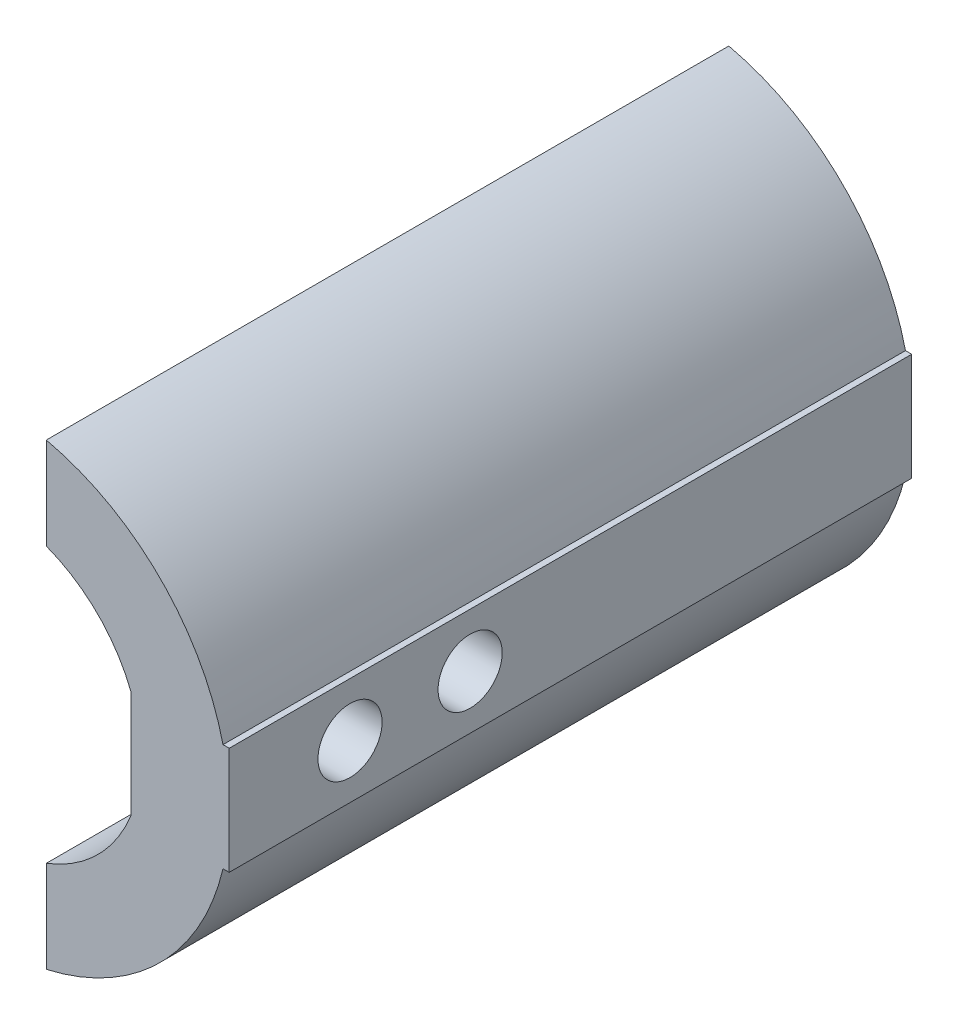
ISO-10303-21;
HEADER;
FILE_DESCRIPTION(('STEP AP214'),'2;1');
FILE_NAME('part.step','',(''),(''),'','','');
FILE_SCHEMA(('AUTOMOTIVE_DESIGN { 1 0 10303 214 1 1 1 1 }'));
ENDSEC;
DATA;
#1=APPLICATION_CONTEXT('core data for automotive mechanical design processes');
#2=APPLICATION_PROTOCOL_DEFINITION('international standard','automotive_design',2000,#1);
#3=PRODUCT_CONTEXT('',#1,'mechanical');
#4=PRODUCT('Part','Part','',(#3));
#5=PRODUCT_RELATED_PRODUCT_CATEGORY('part','',(#4));
#6=PRODUCT_DEFINITION_FORMATION('','',#4);
#7=PRODUCT_DEFINITION_CONTEXT('part definition',#1,'design');
#8=PRODUCT_DEFINITION('design','',#6,#7);
#9=PRODUCT_DEFINITION_SHAPE('','',#8);
#10=(LENGTH_UNIT() NAMED_UNIT(*) SI_UNIT(.MILLI.,.METRE.));
#11=(NAMED_UNIT(*) PLANE_ANGLE_UNIT() SI_UNIT($,.RADIAN.));
#12=(NAMED_UNIT(*) SI_UNIT($,.STERADIAN.) SOLID_ANGLE_UNIT());
#13=UNCERTAINTY_MEASURE_WITH_UNIT(LENGTH_MEASURE(1.E-05),#10,'distance_accuracy_value','');
#14=(GEOMETRIC_REPRESENTATION_CONTEXT(3) GLOBAL_UNCERTAINTY_ASSIGNED_CONTEXT((#13)) GLOBAL_UNIT_ASSIGNED_CONTEXT((#10,
#11,#12)) REPRESENTATION_CONTEXT('',''));
#15=CARTESIAN_POINT('',(0.,0.,0.));
#16=DIRECTION('',(0.,0.,1.));
#17=DIRECTION('',(1.,0.,0.));
#18=AXIS2_PLACEMENT_3D('',#15,#16,#17);
#19=CARTESIAN_POINT('',(0.,0.,-25.4));
#20=DIRECTION('',(0.,0.,1.));
#21=DIRECTION('',(1.,0.,0.));
#22=AXIS2_PLACEMENT_3D('',#19,#20,#21);
#23=CYLINDRICAL_SURFACE('',#22,8.74824716524844);
#24=DIRECTION('',(0.,0.,1.));
#25=VECTOR('',#24,1.);
#26=CARTESIAN_POINT('',(1.9407359269552,8.53026216045572,-25.4));
#27=LINE('',#26,#25);
#28=CARTESIAN_POINT('',(1.9407359269552,8.53026216045572,0.));
#29=VERTEX_POINT('',#28);
#30=CARTESIAN_POINT('',(1.9407359269552,8.53026216045572,-25.4));
#31=VERTEX_POINT('',#30);
#32=EDGE_CURVE('E175',#29,#31,#27,.F.);
#33=ORIENTED_EDGE('',*,*,#32,.F.);
#34=CARTESIAN_POINT('',(0.,0.,0.));
#35=DIRECTION('',(0.,0.,1.));
#36=DIRECTION('',(1.,0.,0.));
#37=AXIS2_PLACEMENT_3D('',#34,#35,#36);
#38=CIRCLE('',#37,8.74824716524844);
#39=CARTESIAN_POINT('',(8.51656200965374,2.,0.));
#40=VERTEX_POINT('',#39);
#41=EDGE_CURVE('E138',#40,#29,#38,.T.);
#42=ORIENTED_EDGE('',*,*,#41,.F.);
#43=DIRECTION('',(0.,0.,1.));
#44=VECTOR('',#43,1.);
#45=CARTESIAN_POINT('',(8.51656200965374,2.,-25.4));
#46=LINE('',#45,#44);
#47=CARTESIAN_POINT('',(8.51656200965374,2.,-25.4));
#48=VERTEX_POINT('',#47);
#49=EDGE_CURVE('E47',#48,#40,#46,.T.);
#50=ORIENTED_EDGE('',*,*,#49,.F.);
#51=CARTESIAN_POINT('',(0.,0.,-25.4));
#52=DIRECTION('',(0.,0.,1.));
#53=DIRECTION('',(1.,0.,0.));
#54=AXIS2_PLACEMENT_3D('',#51,#52,#53);
#55=CIRCLE('',#54,8.74824716524844);
#56=EDGE_CURVE('E152',#48,#31,#55,.T.);
#57=ORIENTED_EDGE('',*,*,#56,.T.);
#58=EDGE_LOOP('',(#33,#42,#50,#57));
#59=FACE_BOUND('',#58,.T.);
#60=ADVANCED_FACE('F39',(#59),#23,.T.);
#61=CARTESIAN_POINT('',(8.74824716524844,2.,-25.4));
#62=DIRECTION('',(0.,1.,0.));
#63=DIRECTION('',(-1.,0.,0.));
#64=AXIS2_PLACEMENT_3D('',#61,#62,#63);
#65=PLANE('',#64);
#66=DIRECTION('',(-1.,0.,0.));
#67=VECTOR('',#66,1.);
#68=CARTESIAN_POINT('',(8.74824716524844,2.,0.));
#69=LINE('',#68,#67);
#70=CARTESIAN_POINT('',(8.74824716524844,2.,0.));
#71=VERTEX_POINT('',#70);
#72=EDGE_CURVE('E149',#71,#40,#69,.T.);
#73=ORIENTED_EDGE('',*,*,#72,.F.);
#74=DIRECTION('',(0.,0.,1.));
#75=VECTOR('',#74,1.);
#76=CARTESIAN_POINT('',(8.74824716524844,2.,-25.4));
#77=LINE('',#76,#75);
#78=CARTESIAN_POINT('',(8.74824716524844,2.,-25.4));
#79=VERTEX_POINT('',#78);
#80=EDGE_CURVE('E154',#79,#71,#77,.T.);
#81=ORIENTED_EDGE('',*,*,#80,.F.);
#82=DIRECTION('',(-1.,0.,0.));
#83=VECTOR('',#82,1.);
#84=CARTESIAN_POINT('',(8.74824716524844,2.,-25.4));
#85=LINE('',#84,#83);
#86=EDGE_CURVE('E158',#79,#48,#85,.T.);
#87=ORIENTED_EDGE('',*,*,#86,.T.);
#88=ORIENTED_EDGE('',*,*,#49,.T.);
#89=EDGE_LOOP('',(#73,#81,#87,#88));
#90=FACE_BOUND('',#89,.T.);
#91=ADVANCED_FACE('F209',(#90),#65,.T.);
#92=CARTESIAN_POINT('',(8.74824716524844,-2.000000064,-25.4));
#93=DIRECTION('',(1.,0.,0.));
#94=DIRECTION('',(0.,0.,-1.));
#95=AXIS2_PLACEMENT_3D('',#92,#93,#94);
#96=PLANE('',#95);
#97=CARTESIAN_POINT('',(8.74824716524844,0.,-4.4958));
#98=DIRECTION('',(1.,0.,0.));
#99=DIRECTION('',(0.,0.,-1.));
#100=AXIS2_PLACEMENT_3D('',#97,#98,#99);
#101=CIRCLE('',#100,1.1938);
#102=CARTESIAN_POINT('',(8.74824716524844,0.,-5.6896));
#103=VERTEX_POINT('',#102);
#104=EDGE_CURVE('E169',#103,#103,#101,.T.);
#105=ORIENTED_EDGE('',*,*,#104,.F.);
#106=EDGE_LOOP('',(#105));
#107=FACE_BOUND('',#106,.T.);
#108=CARTESIAN_POINT('',(8.74824716524844,0.,-8.9662));
#109=DIRECTION('',(1.,0.,0.));
#110=DIRECTION('',(0.,0.,-1.));
#111=AXIS2_PLACEMENT_3D('',#108,#109,#110);
#112=CIRCLE('',#111,1.1938);
#113=CARTESIAN_POINT('',(8.74824716524844,0.,-10.16));
#114=VERTEX_POINT('',#113);
#115=EDGE_CURVE('E161',#114,#114,#112,.T.);
#116=ORIENTED_EDGE('',*,*,#115,.F.);
#117=EDGE_LOOP('',(#116));
#118=FACE_BOUND('',#117,.T.);
#119=DIRECTION('',(0.,1.,0.));
#120=VECTOR('',#119,1.);
#121=CARTESIAN_POINT('',(8.74824716524844,-2.000000064,0.));
#122=LINE('',#121,#120);
#123=CARTESIAN_POINT('',(8.74824716524844,-2.000000064,0.));
#124=VERTEX_POINT('',#123);
#125=EDGE_CURVE('E140',#124,#71,#122,.T.);
#126=ORIENTED_EDGE('',*,*,#125,.F.);
#127=DIRECTION('',(0.,0.,1.));
#128=VECTOR('',#127,1.);
#129=CARTESIAN_POINT('',(8.74824716524844,-2.000000064,-25.4));
#130=LINE('',#129,#128);
#131=CARTESIAN_POINT('',(8.74824716524844,-2.000000064,-25.4));
#132=VERTEX_POINT('',#131);
#133=EDGE_CURVE('E156',#132,#124,#130,.T.);
#134=ORIENTED_EDGE('',*,*,#133,.F.);
#135=DIRECTION('',(0.,1.,0.));
#136=VECTOR('',#135,1.);
#137=CARTESIAN_POINT('',(8.74824716524844,-2.000000064,-25.4));
#138=LINE('',#137,#136);
#139=EDGE_CURVE('E203',#132,#79,#138,.T.);
#140=ORIENTED_EDGE('',*,*,#139,.T.);
#141=ORIENTED_EDGE('',*,*,#80,.T.);
#142=EDGE_LOOP('',(#126,#134,#140,#141));
#143=FACE_BOUND('',#142,.T.);
#144=ADVANCED_FACE('F221',(#107,#118,#143),#96,.T.);
#145=CARTESIAN_POINT('',(8.5165619946242,-2.000000064,-25.4));
#146=DIRECTION('',(0.,-1.,0.));
#147=DIRECTION('',(0.,0.,-1.));
#148=AXIS2_PLACEMENT_3D('',#145,#146,#147);
#149=PLANE('',#148);
#150=DIRECTION('',(1.,0.,0.));
#151=VECTOR('',#150,1.);
#152=CARTESIAN_POINT('',(8.5165619946242,-2.000000064,0.));
#153=LINE('',#152,#151);
#154=CARTESIAN_POINT('',(8.5165619946242,-2.000000064,0.));
#155=VERTEX_POINT('',#154);
#156=EDGE_CURVE('E137',#155,#124,#153,.T.);
#157=ORIENTED_EDGE('',*,*,#156,.F.);
#158=DIRECTION('',(0.,0.,1.));
#159=VECTOR('',#158,1.);
#160=CARTESIAN_POINT('',(8.5165619946242,-2.000000064,-25.4));
#161=LINE('',#160,#159);
#162=CARTESIAN_POINT('',(8.5165619946242,-2.000000064,-25.4));
#163=VERTEX_POINT('',#162);
#164=EDGE_CURVE('E135',#163,#155,#161,.T.);
#165=ORIENTED_EDGE('',*,*,#164,.F.);
#166=DIRECTION('',(1.,0.,0.));
#167=VECTOR('',#166,1.);
#168=CARTESIAN_POINT('',(8.5165619946242,-2.000000064,-25.4));
#169=LINE('',#168,#167);
#170=EDGE_CURVE('E200',#163,#132,#169,.T.);
#171=ORIENTED_EDGE('',*,*,#170,.T.);
#172=ORIENTED_EDGE('',*,*,#133,.T.);
#173=EDGE_LOOP('',(#157,#165,#171,#172));
#174=FACE_BOUND('',#173,.T.);
#175=ADVANCED_FACE('F223',(#174),#149,.T.);
#176=CARTESIAN_POINT('',(0.,0.,-25.4));
#177=DIRECTION('',(0.,0.,1.));
#178=DIRECTION('',(1.,0.,0.));
#179=AXIS2_PLACEMENT_3D('',#176,#177,#178);
#180=CYLINDRICAL_SURFACE('',#179,8.74824716524844);
#181=DIRECTION('',(0.,0.,1.));
#182=VECTOR('',#181,1.);
#183=CARTESIAN_POINT('',(1.9407359269552,-8.53026216045573,-25.4));
#184=LINE('',#183,#182);
#185=CARTESIAN_POINT('',(1.9407359269552,-8.53026216045573,-25.4));
#186=VERTEX_POINT('',#185);
#187=CARTESIAN_POINT('',(1.9407359269552,-8.53026216045572,0.));
#188=VERTEX_POINT('',#187);
#189=EDGE_CURVE('E114',#186,#188,#184,.T.);
#190=ORIENTED_EDGE('',*,*,#189,.F.);
#191=CARTESIAN_POINT('',(0.,0.,-25.4));
#192=DIRECTION('',(0.,0.,1.));
#193=DIRECTION('',(1.,0.,0.));
#194=AXIS2_PLACEMENT_3D('',#191,#192,#193);
#195=CIRCLE('',#194,8.74824716524844);
#196=EDGE_CURVE('E198',#186,#163,#195,.T.);
#197=ORIENTED_EDGE('',*,*,#196,.T.);
#198=ORIENTED_EDGE('',*,*,#164,.T.);
#199=CARTESIAN_POINT('',(0.,0.,0.));
#200=DIRECTION('',(0.,0.,1.));
#201=DIRECTION('',(1.,0.,0.));
#202=AXIS2_PLACEMENT_3D('',#199,#200,#201);
#203=CIRCLE('',#202,8.74824716524844);
#204=EDGE_CURVE('E127',#188,#155,#203,.T.);
#205=ORIENTED_EDGE('',*,*,#204,.F.);
#206=EDGE_LOOP('',(#190,#197,#198,#205));
#207=FACE_BOUND('',#206,.T.);
#208=ADVANCED_FACE('F133',(#207),#180,.T.);
#209=CARTESIAN_POINT('',(0.,0.,-25.4));
#210=DIRECTION('',(0.,0.,1.));
#211=DIRECTION('',(1.,0.,0.));
#212=AXIS2_PLACEMENT_3D('',#209,#210,#211);
#213=PLANE('',#212);
#214=ORIENTED_EDGE('',*,*,#196,.F.);
#215=DIRECTION('',(0.,1.,0.));
#216=VECTOR('',#215,1.);
#217=CARTESIAN_POINT('',(1.9407359269552,0.,-25.4));
#218=LINE('',#217,#216);
#219=CARTESIAN_POINT('',(1.9407359269552,-5.1116327680775,-25.4));
#220=VERTEX_POINT('',#219);
#221=EDGE_CURVE('E117',#186,#220,#218,.T.);
#222=ORIENTED_EDGE('',*,*,#221,.T.);
#223=CARTESIAN_POINT('',(0.,0.,-25.4));
#224=DIRECTION('',(0.,0.,1.));
#225=DIRECTION('',(1.,0.,0.));
#226=AXIS2_PLACEMENT_3D('',#223,#224,#225);
#227=CIRCLE('',#226,5.46765447828027);
#228=CARTESIAN_POINT('',(5.08873709655532,-2.000000064,-25.4));
#229=VERTEX_POINT('',#228);
#230=EDGE_CURVE('E181',#220,#229,#227,.T.);
#231=ORIENTED_EDGE('',*,*,#230,.T.);
#232=DIRECTION('',(6.2883972196111E-09,1.,0.));
#233=VECTOR('',#232,1.);
#234=CARTESIAN_POINT('',(5.08873712170892,2.,-25.4));
#235=LINE('',#234,#233);
#236=CARTESIAN_POINT('',(5.08873712170892,2.,-25.4));
#237=VERTEX_POINT('',#236);
#238=EDGE_CURVE('E184',#229,#237,#235,.T.);
#239=ORIENTED_EDGE('',*,*,#238,.T.);
#240=CARTESIAN_POINT('',(0.,0.,-25.4));
#241=DIRECTION('',(0.,0.,1.));
#242=DIRECTION('',(1.,0.,0.));
#243=AXIS2_PLACEMENT_3D('',#240,#241,#242);
#244=CIRCLE('',#243,5.46765447828028);
#245=CARTESIAN_POINT('',(1.9407359269552,5.11163276807751,-25.4));
#246=VERTEX_POINT('',#245);
#247=EDGE_CURVE('E178',#237,#246,#244,.T.);
#248=ORIENTED_EDGE('',*,*,#247,.T.);
#249=EDGE_CURVE('E55',#246,#31,#218,.T.);
#250=ORIENTED_EDGE('',*,*,#249,.T.);
#251=ORIENTED_EDGE('',*,*,#56,.F.);
#252=ORIENTED_EDGE('',*,*,#86,.F.);
#253=ORIENTED_EDGE('',*,*,#139,.F.);
#254=ORIENTED_EDGE('',*,*,#170,.F.);
#255=EDGE_LOOP('',(#214,#222,#231,#239,#248,#250,#251,#252,#253,#254));
#256=FACE_BOUND('',#255,.T.);
#257=ADVANCED_FACE('F214',(#256),#213,.F.);
#258=CARTESIAN_POINT('',(0.,0.,0.));
#259=DIRECTION('',(0.,0.,1.));
#260=DIRECTION('',(1.,0.,0.));
#261=AXIS2_PLACEMENT_3D('',#258,#259,#260);
#262=PLANE('',#261);
#263=DIRECTION('',(0.,1.,0.));
#264=VECTOR('',#263,1.);
#265=CARTESIAN_POINT('',(1.9407359269552,9.39600198781985,0.));
#266=LINE('',#265,#264);
#267=CARTESIAN_POINT('',(1.9407359269552,-5.1116327680775,0.));
#268=VERTEX_POINT('',#267);
#269=EDGE_CURVE('E63',#188,#268,#266,.T.);
#270=ORIENTED_EDGE('',*,*,#269,.F.);
#271=ORIENTED_EDGE('',*,*,#204,.T.);
#272=ORIENTED_EDGE('',*,*,#156,.T.);
#273=ORIENTED_EDGE('',*,*,#125,.T.);
#274=ORIENTED_EDGE('',*,*,#72,.T.);
#275=ORIENTED_EDGE('',*,*,#41,.T.);
#276=CARTESIAN_POINT('',(1.9407359269552,5.11163276807751,0.));
#277=VERTEX_POINT('',#276);
#278=EDGE_CURVE('E131',#277,#29,#266,.T.);
#279=ORIENTED_EDGE('',*,*,#278,.F.);
#280=CARTESIAN_POINT('',(0.,0.,0.));
#281=DIRECTION('',(0.,0.,1.));
#282=DIRECTION('',(1.,0.,0.));
#283=AXIS2_PLACEMENT_3D('',#280,#281,#282);
#284=CIRCLE('',#283,5.46765447828028);
#285=CARTESIAN_POINT('',(5.08873712170892,2.,0.));
#286=VERTEX_POINT('',#285);
#287=EDGE_CURVE('E177',#286,#277,#284,.T.);
#288=ORIENTED_EDGE('',*,*,#287,.F.);
#289=DIRECTION('',(6.2883972196111E-09,1.,0.));
#290=VECTOR('',#289,1.);
#291=CARTESIAN_POINT('',(5.08873712170892,2.,0.));
#292=LINE('',#291,#290);
#293=CARTESIAN_POINT('',(5.08873709655532,-2.000000064,0.));
#294=VERTEX_POINT('',#293);
#295=EDGE_CURVE('E182',#294,#286,#292,.T.);
#296=ORIENTED_EDGE('',*,*,#295,.F.);
#297=CARTESIAN_POINT('',(0.,0.,0.));
#298=DIRECTION('',(0.,0.,1.));
#299=DIRECTION('',(1.,0.,0.));
#300=AXIS2_PLACEMENT_3D('',#297,#298,#299);
#301=CIRCLE('',#300,5.46765447828027);
#302=EDGE_CURVE('E130',#268,#294,#301,.T.);
#303=ORIENTED_EDGE('',*,*,#302,.F.);
#304=EDGE_LOOP('',(#270,#271,#272,#273,#274,#275,#279,#288,#296,#303));
#305=FACE_BOUND('',#304,.T.);
#306=ADVANCED_FACE('F125',(#305),#262,.T.);
#307=CARTESIAN_POINT('',(0.,0.,-25.4));
#308=DIRECTION('',(0.,0.,1.));
#309=DIRECTION('',(1.,0.,0.));
#310=AXIS2_PLACEMENT_3D('',#307,#308,#309);
#311=CYLINDRICAL_SURFACE('',#310,5.46765447828028);
#312=ORIENTED_EDGE('',*,*,#287,.T.);
#313=DIRECTION('',(0.,0.,1.));
#314=VECTOR('',#313,1.);
#315=CARTESIAN_POINT('',(1.9407359269552,5.11163276807751,-25.4));
#316=LINE('',#315,#314);
#317=EDGE_CURVE('E121',#277,#246,#316,.F.);
#318=ORIENTED_EDGE('',*,*,#317,.T.);
#319=ORIENTED_EDGE('',*,*,#247,.F.);
#320=DIRECTION('',(0.,0.,1.));
#321=VECTOR('',#320,1.);
#322=CARTESIAN_POINT('',(5.08873712170892,2.,-25.4));
#323=LINE('',#322,#321);
#324=EDGE_CURVE('E143',#237,#286,#323,.T.);
#325=ORIENTED_EDGE('',*,*,#324,.T.);
#326=EDGE_LOOP('',(#312,#318,#319,#325));
#327=FACE_BOUND('',#326,.T.);
#328=ADVANCED_FACE('F233',(#327),#311,.F.);
#329=CARTESIAN_POINT('',(5.08873712170892,2.,-25.4));
#330=DIRECTION('',(1.,-6.2883972196111E-09,0.));
#331=DIRECTION('',(6.2883972196111E-09,1.,0.));
#332=AXIS2_PLACEMENT_3D('',#329,#330,#331);
#333=PLANE('',#332);
#334=CARTESIAN_POINT('',(5.08873710913212,0.,-4.4958));
#335=DIRECTION('',(1.,-6.2883972196111E-09,0.));
#336=DIRECTION('',(6.2883972196111E-09,1.,0.));
#337=AXIS2_PLACEMENT_3D('',#334,#335,#336);
#338=CIRCLE('',#337,1.1938);
#339=CARTESIAN_POINT('',(5.08873711663921,1.1938,-4.4958));
#340=VERTEX_POINT('',#339);
#341=EDGE_CURVE('E42',#340,#340,#338,.T.);
#342=ORIENTED_EDGE('',*,*,#341,.T.);
#343=EDGE_LOOP('',(#342));
#344=FACE_BOUND('',#343,.T.);
#345=CARTESIAN_POINT('',(5.08873710913212,0.,-8.9662));
#346=DIRECTION('',(1.,-6.2883972196111E-09,0.));
#347=DIRECTION('',(6.2883972196111E-09,1.,0.));
#348=AXIS2_PLACEMENT_3D('',#345,#346,#347);
#349=CIRCLE('',#348,1.1938);
#350=CARTESIAN_POINT('',(5.08873711663921,1.1938,-8.9662));
#351=VERTEX_POINT('',#350);
#352=EDGE_CURVE('E159',#351,#351,#349,.T.);
#353=ORIENTED_EDGE('',*,*,#352,.T.);
#354=EDGE_LOOP('',(#353));
#355=FACE_BOUND('',#354,.T.);
#356=ORIENTED_EDGE('',*,*,#295,.T.);
#357=ORIENTED_EDGE('',*,*,#324,.F.);
#358=ORIENTED_EDGE('',*,*,#238,.F.);
#359=DIRECTION('',(0.,0.,1.));
#360=VECTOR('',#359,1.);
#361=CARTESIAN_POINT('',(5.08873709655532,-2.000000064,-25.4));
#362=LINE('',#361,#360);
#363=EDGE_CURVE('E187',#229,#294,#362,.T.);
#364=ORIENTED_EDGE('',*,*,#363,.T.);
#365=EDGE_LOOP('',(#356,#357,#358,#364));
#366=FACE_BOUND('',#365,.T.);
#367=ADVANCED_FACE('F230',(#344,#355,#366),#333,.F.);
#368=CARTESIAN_POINT('',(0.,0.,-25.4));
#369=DIRECTION('',(0.,0.,1.));
#370=DIRECTION('',(1.,0.,0.));
#371=AXIS2_PLACEMENT_3D('',#368,#369,#370);
#372=CYLINDRICAL_SURFACE('',#371,5.46765447828027);
#373=ORIENTED_EDGE('',*,*,#230,.F.);
#374=DIRECTION('',(0.,0.,1.));
#375=VECTOR('',#374,1.);
#376=CARTESIAN_POINT('',(1.9407359269552,-5.1116327680775,-25.4));
#377=LINE('',#376,#375);
#378=EDGE_CURVE('E11',#220,#268,#377,.T.);
#379=ORIENTED_EDGE('',*,*,#378,.T.);
#380=ORIENTED_EDGE('',*,*,#302,.T.);
#381=ORIENTED_EDGE('',*,*,#363,.F.);
#382=EDGE_LOOP('',(#373,#379,#380,#381));
#383=FACE_BOUND('',#382,.T.);
#384=ADVANCED_FACE('F227',(#383),#372,.F.);
#385=CARTESIAN_POINT('',(1.9407359269552,9.39600198781985,-50.));
#386=DIRECTION('',(1.,0.,0.));
#387=DIRECTION('',(0.,0.,-1.));
#388=AXIS2_PLACEMENT_3D('',#385,#386,#387);
#389=PLANE('',#388);
#390=ORIENTED_EDGE('',*,*,#189,.T.);
#391=ORIENTED_EDGE('',*,*,#269,.T.);
#392=ORIENTED_EDGE('',*,*,#378,.F.);
#393=ORIENTED_EDGE('',*,*,#221,.F.);
#394=EDGE_LOOP('',(#390,#391,#392,#393));
#395=FACE_BOUND('',#394,.T.);
#396=ADVANCED_FACE('F115',(#395),#389,.F.);
#397=ORIENTED_EDGE('',*,*,#32,.T.);
#398=ORIENTED_EDGE('',*,*,#249,.F.);
#399=ORIENTED_EDGE('',*,*,#317,.F.);
#400=ORIENTED_EDGE('',*,*,#278,.T.);
#401=EDGE_LOOP('',(#397,#398,#399,#400));
#402=FACE_BOUND('',#401,.T.);
#403=ADVANCED_FACE('F235',(#402),#389,.F.);
#404=CARTESIAN_POINT('',(-38.7117528347516,0.,-8.9662));
#405=DIRECTION('',(1.,0.,0.));
#406=DIRECTION('',(0.,0.,-1.));
#407=AXIS2_PLACEMENT_3D('',#404,#405,#406);
#408=CYLINDRICAL_SURFACE('',#407,1.1938);
#409=ORIENTED_EDGE('',*,*,#115,.T.);
#410=EDGE_LOOP('',(#409));
#411=FACE_BOUND('',#410,.T.);
#412=ORIENTED_EDGE('',*,*,#352,.F.);
#413=EDGE_LOOP('',(#412));
#414=FACE_BOUND('',#413,.T.);
#415=ADVANCED_FACE('F237',(#411,#414),#408,.F.);
#416=CARTESIAN_POINT('',(-38.7117528347516,0.,-4.4958));
#417=DIRECTION('',(1.,0.,0.));
#418=DIRECTION('',(0.,0.,-1.));
#419=AXIS2_PLACEMENT_3D('',#416,#417,#418);
#420=CYLINDRICAL_SURFACE('',#419,1.1938);
#421=ORIENTED_EDGE('',*,*,#104,.T.);
#422=EDGE_LOOP('',(#421));
#423=FACE_BOUND('',#422,.T.);
#424=ORIENTED_EDGE('',*,*,#341,.F.);
#425=EDGE_LOOP('',(#424));
#426=FACE_BOUND('',#425,.T.);
#427=ADVANCED_FACE('F243',(#423,#426),#420,.F.);
#428=CLOSED_SHELL('',(#60,#91,#144,#175,#208,#257,#306,#328,#367,#384,#396,#403,#415,#427));
#429=MANIFOLD_SOLID_BREP('B2',#428);
#430=ADVANCED_BREP_SHAPE_REPRESENTATION('',(#18,#429),#14);
#431=SHAPE_DEFINITION_REPRESENTATION(#9,#430);
ENDSEC;
END-ISO-10303-21;
